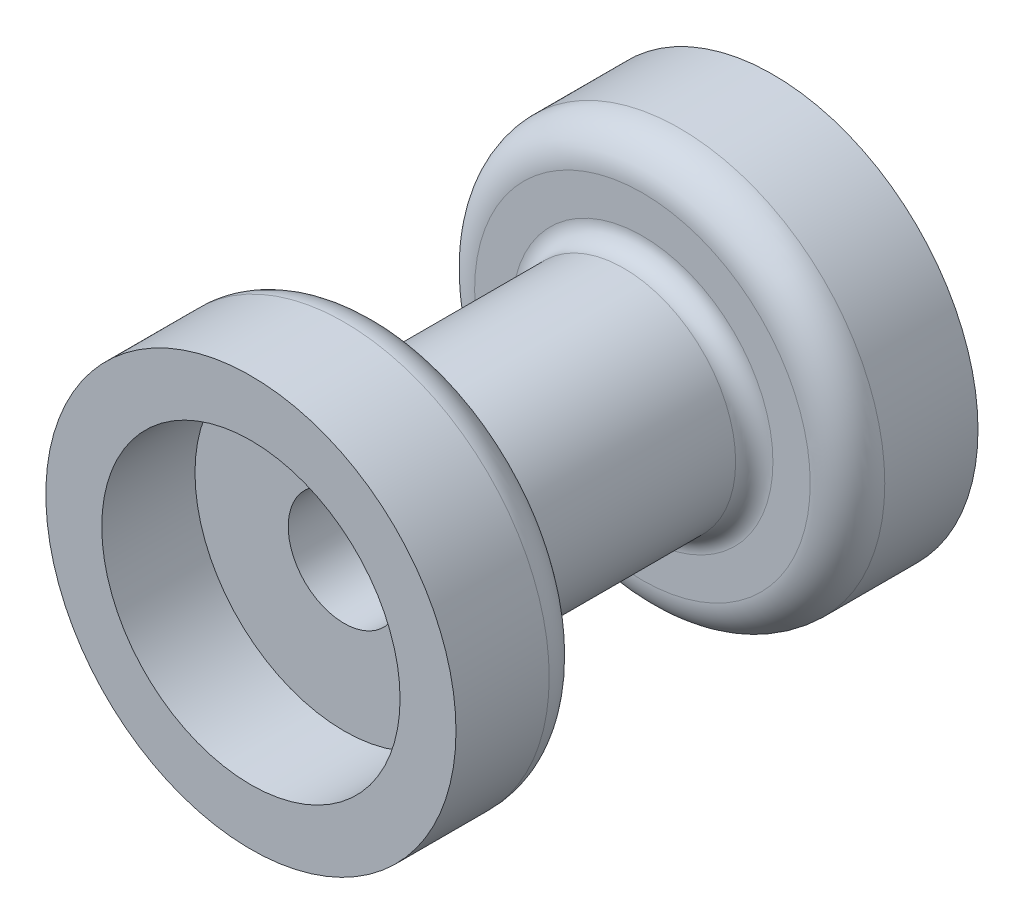
ISO-10303-21;
HEADER;
FILE_DESCRIPTION(('STEP AP214'),'2;1');
FILE_NAME('part.step','',(''),(''),'','','');
FILE_SCHEMA(('AUTOMOTIVE_DESIGN { 1 0 10303 214 1 1 1 1 }'));
ENDSEC;
DATA;
#1=APPLICATION_CONTEXT('core data for automotive mechanical design processes');
#2=APPLICATION_PROTOCOL_DEFINITION('international standard','automotive_design',2000,#1);
#3=PRODUCT_CONTEXT('',#1,'mechanical');
#4=PRODUCT('Part','Part','',(#3));
#5=PRODUCT_RELATED_PRODUCT_CATEGORY('part','',(#4));
#6=PRODUCT_DEFINITION_FORMATION('','',#4);
#7=PRODUCT_DEFINITION_CONTEXT('part definition',#1,'design');
#8=PRODUCT_DEFINITION('design','',#6,#7);
#9=PRODUCT_DEFINITION_SHAPE('','',#8);
#10=(LENGTH_UNIT() NAMED_UNIT(*) SI_UNIT(.MILLI.,.METRE.));
#11=(NAMED_UNIT(*) PLANE_ANGLE_UNIT() SI_UNIT($,.RADIAN.));
#12=(NAMED_UNIT(*) SI_UNIT($,.STERADIAN.) SOLID_ANGLE_UNIT());
#13=UNCERTAINTY_MEASURE_WITH_UNIT(LENGTH_MEASURE(1.E-05),#10,'distance_accuracy_value','');
#14=(GEOMETRIC_REPRESENTATION_CONTEXT(3) GLOBAL_UNCERTAINTY_ASSIGNED_CONTEXT((#13)) GLOBAL_UNIT_ASSIGNED_CONTEXT((#10,
#11,#12)) REPRESENTATION_CONTEXT('',''));
#15=CARTESIAN_POINT('',(0.,0.,0.));
#16=DIRECTION('',(0.,0.,1.));
#17=DIRECTION('',(1.,0.,0.));
#18=AXIS2_PLACEMENT_3D('',#15,#16,#17);
#19=CARTESIAN_POINT('',(0.,0.,0.));
#20=DIRECTION('',(0.,0.,1.));
#21=DIRECTION('',(1.,0.,0.));
#22=AXIS2_PLACEMENT_3D('',#19,#20,#21);
#23=CYLINDRICAL_SURFACE('',#22,8.);
#24=CARTESIAN_POINT('',(0.,0.,-5.));
#25=DIRECTION('',(0.,0.,1.));
#26=DIRECTION('',(1.,0.,0.));
#27=AXIS2_PLACEMENT_3D('',#24,#25,#26);
#28=CIRCLE('',#27,8.);
#29=CARTESIAN_POINT('',(8.,0.,-5.));
#30=VERTEX_POINT('',#29);
#31=EDGE_CURVE('E10',#30,#30,#28,.T.);
#32=ORIENTED_EDGE('',*,*,#31,.F.);
#33=EDGE_LOOP('',(#32));
#34=FACE_BOUND('',#33,.T.);
#35=CARTESIAN_POINT('',(0.,0.,0.));
#36=DIRECTION('',(0.,0.,1.));
#37=DIRECTION('',(1.,0.,0.));
#38=AXIS2_PLACEMENT_3D('',#35,#36,#37);
#39=CIRCLE('',#38,8.);
#40=CARTESIAN_POINT('',(8.,0.,0.));
#41=VERTEX_POINT('',#40);
#42=EDGE_CURVE('E82',#41,#41,#39,.T.);
#43=ORIENTED_EDGE('',*,*,#42,.T.);
#44=EDGE_LOOP('',(#43));
#45=FACE_BOUND('',#44,.T.);
#46=ADVANCED_FACE('F30',(#34,#45),#23,.F.);
#47=CARTESIAN_POINT('',(0.,3.,-5.));
#48=DIRECTION('',(0.,0.,-1.));
#49=DIRECTION('',(-1.,0.,0.));
#50=AXIS2_PLACEMENT_3D('',#47,#48,#49);
#51=PLANE('',#50);
#52=CARTESIAN_POINT('',(0.,0.,-5.));
#53=DIRECTION('',(0.,0.,1.));
#54=DIRECTION('',(1.,0.,0.));
#55=AXIS2_PLACEMENT_3D('',#52,#53,#54);
#56=CIRCLE('',#55,3.);
#57=CARTESIAN_POINT('',(3.,0.,-5.));
#58=VERTEX_POINT('',#57);
#59=EDGE_CURVE('E36',#58,#58,#56,.T.);
#60=ORIENTED_EDGE('',*,*,#59,.F.);
#61=EDGE_LOOP('',(#60));
#62=FACE_BOUND('',#61,.T.);
#63=ORIENTED_EDGE('',*,*,#31,.T.);
#64=EDGE_LOOP('',(#63));
#65=FACE_BOUND('',#64,.T.);
#66=ADVANCED_FACE('F167',(#62,#65),#51,.F.);
#67=CARTESIAN_POINT('',(0.,0.,0.));
#68=DIRECTION('',(0.,0.,1.));
#69=DIRECTION('',(1.,0.,0.));
#70=AXIS2_PLACEMENT_3D('',#67,#68,#69);
#71=CYLINDRICAL_SURFACE('',#70,3.);
#72=CARTESIAN_POINT('',(0.,0.,-23.));
#73=DIRECTION('',(0.,0.,1.));
#74=DIRECTION('',(1.,0.,0.));
#75=AXIS2_PLACEMENT_3D('',#72,#73,#74);
#76=CIRCLE('',#75,3.);
#77=CARTESIAN_POINT('',(3.,0.,-23.));
#78=VERTEX_POINT('',#77);
#79=EDGE_CURVE('E40',#78,#78,#76,.T.);
#80=ORIENTED_EDGE('',*,*,#79,.F.);
#81=EDGE_LOOP('',(#80));
#82=FACE_BOUND('',#81,.T.);
#83=ORIENTED_EDGE('',*,*,#59,.T.);
#84=EDGE_LOOP('',(#83));
#85=FACE_BOUND('',#84,.T.);
#86=ADVANCED_FACE('F162',(#82,#85),#71,.F.);
#87=CARTESIAN_POINT('',(0.,8.00000000000001,-23.));
#88=DIRECTION('',(0.,0.,1.));
#89=DIRECTION('',(1.,0.,0.));
#90=AXIS2_PLACEMENT_3D('',#87,#88,#89);
#91=PLANE('',#90);
#92=CARTESIAN_POINT('',(0.,0.,-23.));
#93=DIRECTION('',(0.,0.,1.));
#94=DIRECTION('',(1.,0.,0.));
#95=AXIS2_PLACEMENT_3D('',#92,#93,#94);
#96=CIRCLE('',#95,8.00000000000001);
#97=CARTESIAN_POINT('',(8.00000000000001,0.,-23.));
#98=VERTEX_POINT('',#97);
#99=EDGE_CURVE('E44',#98,#98,#96,.T.);
#100=ORIENTED_EDGE('',*,*,#99,.F.);
#101=EDGE_LOOP('',(#100));
#102=FACE_BOUND('',#101,.T.);
#103=ORIENTED_EDGE('',*,*,#79,.T.);
#104=EDGE_LOOP('',(#103));
#105=FACE_BOUND('',#104,.T.);
#106=ADVANCED_FACE('F156',(#102,#105),#91,.F.);
#107=CARTESIAN_POINT('',(0.,0.,0.));
#108=DIRECTION('',(0.,0.,1.));
#109=DIRECTION('',(1.,0.,0.));
#110=AXIS2_PLACEMENT_3D('',#107,#108,#109);
#111=CYLINDRICAL_SURFACE('',#110,8.);
#112=CARTESIAN_POINT('',(0.,0.,-28.));
#113=DIRECTION('',(0.,0.,1.));
#114=DIRECTION('',(1.,0.,0.));
#115=AXIS2_PLACEMENT_3D('',#112,#113,#114);
#116=CIRCLE('',#115,8.);
#117=CARTESIAN_POINT('',(8.,0.,-28.));
#118=VERTEX_POINT('',#117);
#119=EDGE_CURVE('E49',#118,#118,#116,.T.);
#120=ORIENTED_EDGE('',*,*,#119,.F.);
#121=EDGE_LOOP('',(#120));
#122=FACE_BOUND('',#121,.T.);
#123=ORIENTED_EDGE('',*,*,#99,.T.);
#124=EDGE_LOOP('',(#123));
#125=FACE_BOUND('',#124,.T.);
#126=ADVANCED_FACE('F150',(#122,#125),#111,.F.);
#127=CARTESIAN_POINT('',(0.,11.,-28.));
#128=DIRECTION('',(0.,0.,1.));
#129=DIRECTION('',(1.,0.,0.));
#130=AXIS2_PLACEMENT_3D('',#127,#128,#129);
#131=PLANE('',#130);
#132=CARTESIAN_POINT('',(0.,0.,-28.));
#133=DIRECTION('',(0.,0.,1.));
#134=DIRECTION('',(1.,0.,0.));
#135=AXIS2_PLACEMENT_3D('',#132,#133,#134);
#136=CIRCLE('',#135,11.);
#137=CARTESIAN_POINT('',(11.,0.,-28.));
#138=VERTEX_POINT('',#137);
#139=EDGE_CURVE('E52',#138,#138,#136,.T.);
#140=ORIENTED_EDGE('',*,*,#139,.F.);
#141=EDGE_LOOP('',(#140));
#142=FACE_BOUND('',#141,.T.);
#143=ORIENTED_EDGE('',*,*,#119,.T.);
#144=EDGE_LOOP('',(#143));
#145=FACE_BOUND('',#144,.T.);
#146=ADVANCED_FACE('F144',(#142,#145),#131,.F.);
#147=CARTESIAN_POINT('',(0.,0.,0.));
#148=DIRECTION('',(0.,0.,1.));
#149=DIRECTION('',(1.,0.,0.));
#150=AXIS2_PLACEMENT_3D('',#147,#148,#149);
#151=CYLINDRICAL_SURFACE('',#150,11.);
#152=CARTESIAN_POINT('',(0.,0.,-23.));
#153=DIRECTION('',(0.,0.,1.));
#154=DIRECTION('',(1.,0.,0.));
#155=AXIS2_PLACEMENT_3D('',#152,#153,#154);
#156=CIRCLE('',#155,11.);
#157=CARTESIAN_POINT('',(11.,0.,-23.));
#158=VERTEX_POINT('',#157);
#159=EDGE_CURVE('E55',#158,#158,#156,.T.);
#160=ORIENTED_EDGE('',*,*,#159,.F.);
#161=EDGE_LOOP('',(#160));
#162=FACE_BOUND('',#161,.T.);
#163=ORIENTED_EDGE('',*,*,#139,.T.);
#164=EDGE_LOOP('',(#163));
#165=FACE_BOUND('',#164,.T.);
#166=ADVANCED_FACE('F138',(#162,#165),#151,.T.);
#167=CARTESIAN_POINT('',(0.,0.,-23.));
#168=DIRECTION('',(0.,0.,1.));
#169=DIRECTION('',(1.,0.,0.));
#170=AXIS2_PLACEMENT_3D('',#167,#168,#169);
#171=TOROIDAL_SURFACE('',#170,9.,2.);
#172=CARTESIAN_POINT('',(0.,0.,-21.));
#173=DIRECTION('',(0.,0.,1.));
#174=DIRECTION('',(1.,0.,0.));
#175=AXIS2_PLACEMENT_3D('',#172,#173,#174);
#176=CIRCLE('',#175,9.);
#177=CARTESIAN_POINT('',(9.,0.,-21.));
#178=VERTEX_POINT('',#177);
#179=EDGE_CURVE('E58',#178,#178,#176,.T.);
#180=ORIENTED_EDGE('',*,*,#179,.F.);
#181=EDGE_LOOP('',(#180));
#182=FACE_BOUND('',#181,.T.);
#183=ORIENTED_EDGE('',*,*,#159,.T.);
#184=EDGE_LOOP('',(#183));
#185=FACE_BOUND('',#184,.T.);
#186=ADVANCED_FACE('F132',(#182,#185),#171,.T.);
#187=CARTESIAN_POINT('',(0.,7.,-21.));
#188=DIRECTION('',(0.,0.,-1.));
#189=DIRECTION('',(-1.,0.,0.));
#190=AXIS2_PLACEMENT_3D('',#187,#188,#189);
#191=PLANE('',#190);
#192=CARTESIAN_POINT('',(0.,0.,-21.));
#193=DIRECTION('',(0.,0.,1.));
#194=DIRECTION('',(1.,0.,0.));
#195=AXIS2_PLACEMENT_3D('',#192,#193,#194);
#196=CIRCLE('',#195,7.);
#197=CARTESIAN_POINT('',(7.,0.,-21.));
#198=VERTEX_POINT('',#197);
#199=EDGE_CURVE('E61',#198,#198,#196,.T.);
#200=ORIENTED_EDGE('',*,*,#199,.F.);
#201=EDGE_LOOP('',(#200));
#202=FACE_BOUND('',#201,.T.);
#203=ORIENTED_EDGE('',*,*,#179,.T.);
#204=EDGE_LOOP('',(#203));
#205=FACE_BOUND('',#204,.T.);
#206=ADVANCED_FACE('F126',(#202,#205),#191,.F.);
#207=CARTESIAN_POINT('',(0.,0.,-20.));
#208=DIRECTION('',(0.,0.,1.));
#209=DIRECTION('',(1.,0.,0.));
#210=AXIS2_PLACEMENT_3D('',#207,#208,#209);
#211=TOROIDAL_SURFACE('',#210,7.,1.);
#212=CARTESIAN_POINT('',(0.,0.,-20.));
#213=DIRECTION('',(0.,0.,1.));
#214=DIRECTION('',(1.,0.,0.));
#215=AXIS2_PLACEMENT_3D('',#212,#213,#214);
#216=CIRCLE('',#215,6.);
#217=CARTESIAN_POINT('',(6.,0.,-20.));
#218=VERTEX_POINT('',#217);
#219=EDGE_CURVE('E64',#218,#218,#216,.T.);
#220=ORIENTED_EDGE('',*,*,#219,.F.);
#221=EDGE_LOOP('',(#220));
#222=FACE_BOUND('',#221,.T.);
#223=ORIENTED_EDGE('',*,*,#199,.T.);
#224=EDGE_LOOP('',(#223));
#225=FACE_BOUND('',#224,.T.);
#226=ADVANCED_FACE('F120',(#222,#225),#211,.F.);
#227=CARTESIAN_POINT('',(0.,0.,0.));
#228=DIRECTION('',(0.,0.,1.));
#229=DIRECTION('',(1.,0.,0.));
#230=AXIS2_PLACEMENT_3D('',#227,#228,#229);
#231=CYLINDRICAL_SURFACE('',#230,6.);
#232=CARTESIAN_POINT('',(0.,0.,-8.));
#233=DIRECTION('',(0.,0.,1.));
#234=DIRECTION('',(1.,0.,0.));
#235=AXIS2_PLACEMENT_3D('',#232,#233,#234);
#236=CIRCLE('',#235,6.);
#237=CARTESIAN_POINT('',(6.,0.,-8.));
#238=VERTEX_POINT('',#237);
#239=EDGE_CURVE('E67',#238,#238,#236,.T.);
#240=ORIENTED_EDGE('',*,*,#239,.F.);
#241=EDGE_LOOP('',(#240));
#242=FACE_BOUND('',#241,.T.);
#243=ORIENTED_EDGE('',*,*,#219,.T.);
#244=EDGE_LOOP('',(#243));
#245=FACE_BOUND('',#244,.T.);
#246=ADVANCED_FACE('F114',(#242,#245),#231,.T.);
#247=CARTESIAN_POINT('',(0.,0.,-8.));
#248=DIRECTION('',(0.,0.,1.));
#249=DIRECTION('',(1.,0.,0.));
#250=AXIS2_PLACEMENT_3D('',#247,#248,#249);
#251=TOROIDAL_SURFACE('',#250,7.,1.);
#252=CARTESIAN_POINT('',(0.,0.,-7.));
#253=DIRECTION('',(0.,0.,1.));
#254=DIRECTION('',(1.,0.,0.));
#255=AXIS2_PLACEMENT_3D('',#252,#253,#254);
#256=CIRCLE('',#255,7.);
#257=CARTESIAN_POINT('',(7.,0.,-7.));
#258=VERTEX_POINT('',#257);
#259=EDGE_CURVE('E70',#258,#258,#256,.T.);
#260=ORIENTED_EDGE('',*,*,#259,.F.);
#261=EDGE_LOOP('',(#260));
#262=FACE_BOUND('',#261,.T.);
#263=ORIENTED_EDGE('',*,*,#239,.T.);
#264=EDGE_LOOP('',(#263));
#265=FACE_BOUND('',#264,.T.);
#266=ADVANCED_FACE('F108',(#262,#265),#251,.F.);
#267=CARTESIAN_POINT('',(0.,9.,-7.));
#268=DIRECTION('',(0.,0.,1.));
#269=DIRECTION('',(1.,0.,0.));
#270=AXIS2_PLACEMENT_3D('',#267,#268,#269);
#271=PLANE('',#270);
#272=CARTESIAN_POINT('',(0.,0.,-7.));
#273=DIRECTION('',(0.,0.,1.));
#274=DIRECTION('',(1.,0.,0.));
#275=AXIS2_PLACEMENT_3D('',#272,#273,#274);
#276=CIRCLE('',#275,9.);
#277=CARTESIAN_POINT('',(9.,0.,-7.));
#278=VERTEX_POINT('',#277);
#279=EDGE_CURVE('E73',#278,#278,#276,.T.);
#280=ORIENTED_EDGE('',*,*,#279,.F.);
#281=EDGE_LOOP('',(#280));
#282=FACE_BOUND('',#281,.T.);
#283=ORIENTED_EDGE('',*,*,#259,.T.);
#284=EDGE_LOOP('',(#283));
#285=FACE_BOUND('',#284,.T.);
#286=ADVANCED_FACE('F102',(#282,#285),#271,.F.);
#287=CARTESIAN_POINT('',(0.,0.,-5.));
#288=DIRECTION('',(0.,0.,1.));
#289=DIRECTION('',(1.,0.,0.));
#290=AXIS2_PLACEMENT_3D('',#287,#288,#289);
#291=TOROIDAL_SURFACE('',#290,9.,2.);
#292=CARTESIAN_POINT('',(0.,0.,-5.));
#293=DIRECTION('',(0.,0.,1.));
#294=DIRECTION('',(1.,0.,0.));
#295=AXIS2_PLACEMENT_3D('',#292,#293,#294);
#296=CIRCLE('',#295,11.);
#297=CARTESIAN_POINT('',(11.,0.,-5.));
#298=VERTEX_POINT('',#297);
#299=EDGE_CURVE('E76',#298,#298,#296,.T.);
#300=ORIENTED_EDGE('',*,*,#299,.F.);
#301=EDGE_LOOP('',(#300));
#302=FACE_BOUND('',#301,.T.);
#303=ORIENTED_EDGE('',*,*,#279,.T.);
#304=EDGE_LOOP('',(#303));
#305=FACE_BOUND('',#304,.T.);
#306=ADVANCED_FACE('F96',(#302,#305),#291,.T.);
#307=CARTESIAN_POINT('',(0.,0.,0.));
#308=DIRECTION('',(0.,0.,1.));
#309=DIRECTION('',(1.,0.,0.));
#310=AXIS2_PLACEMENT_3D('',#307,#308,#309);
#311=CYLINDRICAL_SURFACE('',#310,11.);
#312=CARTESIAN_POINT('',(0.,0.,0.));
#313=DIRECTION('',(0.,0.,1.));
#314=DIRECTION('',(1.,0.,0.));
#315=AXIS2_PLACEMENT_3D('',#312,#313,#314);
#316=CIRCLE('',#315,11.);
#317=CARTESIAN_POINT('',(11.,0.,0.));
#318=VERTEX_POINT('',#317);
#319=EDGE_CURVE('E79',#318,#318,#316,.T.);
#320=ORIENTED_EDGE('',*,*,#319,.F.);
#321=EDGE_LOOP('',(#320));
#322=FACE_BOUND('',#321,.T.);
#323=ORIENTED_EDGE('',*,*,#299,.T.);
#324=EDGE_LOOP('',(#323));
#325=FACE_BOUND('',#324,.T.);
#326=ADVANCED_FACE('F90',(#322,#325),#311,.T.);
#327=CARTESIAN_POINT('',(0.,8.,0.));
#328=DIRECTION('',(0.,0.,-1.));
#329=DIRECTION('',(-1.,0.,0.));
#330=AXIS2_PLACEMENT_3D('',#327,#328,#329);
#331=PLANE('',#330);
#332=ORIENTED_EDGE('',*,*,#42,.F.);
#333=EDGE_LOOP('',(#332));
#334=FACE_BOUND('',#333,.T.);
#335=ORIENTED_EDGE('',*,*,#319,.T.);
#336=EDGE_LOOP('',(#335));
#337=FACE_BOUND('',#336,.T.);
#338=ADVANCED_FACE('F87',(#334,#337),#331,.F.);
#339=CLOSED_SHELL('',(#46,#66,#86,#106,#126,#146,#166,#186,#206,#226,#246,#266,#286,#306,#326,#338));
#340=MANIFOLD_SOLID_BREP('B2',#339);
#341=ADVANCED_BREP_SHAPE_REPRESENTATION('',(#18,#340),#14);
#342=SHAPE_DEFINITION_REPRESENTATION(#9,#341);
ENDSEC;
END-ISO-10303-21;
